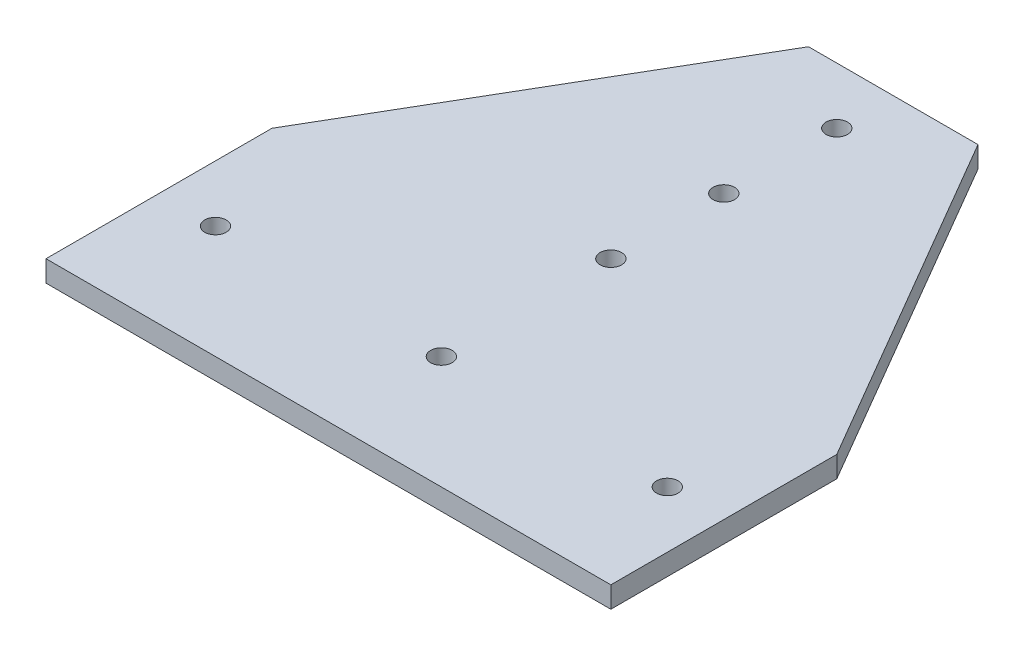
ISO-10303-21;
HEADER;
FILE_DESCRIPTION(('STEP AP214'),'2;1');
FILE_NAME('part.step','',(''),(''),'','','');
FILE_SCHEMA(('AUTOMOTIVE_DESIGN { 1 0 10303 214 1 1 1 1 }'));
ENDSEC;
DATA;
#1=APPLICATION_CONTEXT('core data for automotive mechanical design processes');
#2=APPLICATION_PROTOCOL_DEFINITION('international standard','automotive_design',2000,#1);
#3=PRODUCT_CONTEXT('',#1,'mechanical');
#4=PRODUCT('Part','Part','',(#3));
#5=PRODUCT_RELATED_PRODUCT_CATEGORY('part','',(#4));
#6=PRODUCT_DEFINITION_FORMATION('','',#4);
#7=PRODUCT_DEFINITION_CONTEXT('part definition',#1,'design');
#8=PRODUCT_DEFINITION('design','',#6,#7);
#9=PRODUCT_DEFINITION_SHAPE('','',#8);
#10=(LENGTH_UNIT() NAMED_UNIT(*) SI_UNIT(.MILLI.,.METRE.));
#11=(NAMED_UNIT(*) PLANE_ANGLE_UNIT() SI_UNIT($,.RADIAN.));
#12=(NAMED_UNIT(*) SI_UNIT($,.STERADIAN.) SOLID_ANGLE_UNIT());
#13=UNCERTAINTY_MEASURE_WITH_UNIT(LENGTH_MEASURE(1.E-05),#10,'distance_accuracy_value','');
#14=(GEOMETRIC_REPRESENTATION_CONTEXT(3) GLOBAL_UNCERTAINTY_ASSIGNED_CONTEXT((#13)) GLOBAL_UNIT_ASSIGNED_CONTEXT((#10,
#11,#12)) REPRESENTATION_CONTEXT('',''));
#15=CARTESIAN_POINT('',(0.,0.,0.));
#16=DIRECTION('',(0.,0.,1.));
#17=DIRECTION('',(1.,0.,0.));
#18=AXIS2_PLACEMENT_3D('',#15,#16,#17);
#19=CARTESIAN_POINT('',(41.8507772020725,4.7625,-24.4129533678756));
#20=DIRECTION('',(0.863778900898433,0.,-0.503871025524086));
#21=DIRECTION('',(-0.503871025524086,0.,-0.863778900898434));
#22=AXIS2_PLACEMENT_3D('',#19,#20,#21);
#23=PLANE('',#22);
#24=DIRECTION('',(0.503871025524086,0.,0.863778900898433));
#25=VECTOR('',#24,1.);
#26=CARTESIAN_POINT('',(41.8507772020725,0.,-24.4129533678756));
#27=LINE('',#26,#25);
#28=CARTESIAN_POINT('',(19.05,0.,-63.5));
#29=VERTEX_POINT('',#28);
#30=CARTESIAN_POINT('',(63.5,0.,12.7000000000001));
#31=VERTEX_POINT('',#30);
#32=EDGE_CURVE('E133',#29,#31,#27,.T.);
#33=ORIENTED_EDGE('',*,*,#32,.F.);
#34=DIRECTION('',(0.,-1.,0.));
#35=VECTOR('',#34,1.);
#36=CARTESIAN_POINT('',(19.05,4.7625,-63.5));
#37=LINE('',#36,#35);
#38=CARTESIAN_POINT('',(19.05,4.7625,-63.5));
#39=VERTEX_POINT('',#38);
#40=EDGE_CURVE('E11',#39,#29,#37,.T.);
#41=ORIENTED_EDGE('',*,*,#40,.F.);
#42=DIRECTION('',(0.503871025524086,0.,0.863778900898433));
#43=VECTOR('',#42,1.);
#44=CARTESIAN_POINT('',(41.8507772020725,4.7625,-24.4129533678756));
#45=LINE('',#44,#43);
#46=CARTESIAN_POINT('',(63.5,4.7625,12.7000000000001));
#47=VERTEX_POINT('',#46);
#48=EDGE_CURVE('E353',#39,#47,#45,.T.);
#49=ORIENTED_EDGE('',*,*,#48,.T.);
#50=DIRECTION('',(0.,-1.,0.));
#51=VECTOR('',#50,1.);
#52=CARTESIAN_POINT('',(63.5,4.7625,12.7000000000001));
#53=LINE('',#52,#51);
#54=EDGE_CURVE('E56',#47,#31,#53,.T.);
#55=ORIENTED_EDGE('',*,*,#54,.T.);
#56=EDGE_LOOP('',(#33,#41,#49,#55));
#57=FACE_BOUND('',#56,.T.);
#58=ADVANCED_FACE('F39',(#57),#23,.T.);
#59=CARTESIAN_POINT('',(0.,4.7625,-63.5));
#60=DIRECTION('',(0.,0.,-1.));
#61=DIRECTION('',(-1.,0.,0.));
#62=AXIS2_PLACEMENT_3D('',#59,#60,#61);
#63=PLANE('',#62);
#64=DIRECTION('',(1.,0.,0.));
#65=VECTOR('',#64,1.);
#66=CARTESIAN_POINT('',(0.,0.,-63.5));
#67=LINE('',#66,#65);
#68=CARTESIAN_POINT('',(-19.05,0.,-63.5));
#69=VERTEX_POINT('',#68);
#70=EDGE_CURVE('E130',#69,#29,#67,.T.);
#71=ORIENTED_EDGE('',*,*,#70,.F.);
#72=DIRECTION('',(0.,-1.,0.));
#73=VECTOR('',#72,1.);
#74=CARTESIAN_POINT('',(-19.05,4.7625,-63.5));
#75=LINE('',#74,#73);
#76=CARTESIAN_POINT('',(-19.05,4.7625,-63.5));
#77=VERTEX_POINT('',#76);
#78=EDGE_CURVE('E48',#77,#69,#75,.T.);
#79=ORIENTED_EDGE('',*,*,#78,.F.);
#80=DIRECTION('',(1.,0.,0.));
#81=VECTOR('',#80,1.);
#82=CARTESIAN_POINT('',(0.,4.7625,-63.5));
#83=LINE('',#82,#81);
#84=EDGE_CURVE('E355',#77,#39,#83,.T.);
#85=ORIENTED_EDGE('',*,*,#84,.T.);
#86=ORIENTED_EDGE('',*,*,#40,.T.);
#87=EDGE_LOOP('',(#71,#79,#85,#86));
#88=FACE_BOUND('',#87,.T.);
#89=ADVANCED_FACE('F131',(#88),#63,.T.);
#90=CARTESIAN_POINT('',(-41.8507772020725,4.7625,-24.4129533678756));
#91=DIRECTION('',(-0.863778900898434,0.,-0.503871025524086));
#92=DIRECTION('',(-0.503871025524086,0.,0.863778900898434));
#93=AXIS2_PLACEMENT_3D('',#90,#91,#92);
#94=PLANE('',#93);
#95=DIRECTION('',(0.503871025524086,0.,-0.863778900898434));
#96=VECTOR('',#95,1.);
#97=CARTESIAN_POINT('',(-41.8507772020725,0.,-24.4129533678756));
#98=LINE('',#97,#96);
#99=CARTESIAN_POINT('',(-63.5,0.,12.7));
#100=VERTEX_POINT('',#99);
#101=EDGE_CURVE('E126',#100,#69,#98,.T.);
#102=ORIENTED_EDGE('',*,*,#101,.F.);
#103=DIRECTION('',(0.,-1.,0.));
#104=VECTOR('',#103,1.);
#105=CARTESIAN_POINT('',(-63.5,4.7625,12.7));
#106=LINE('',#105,#104);
#107=CARTESIAN_POINT('',(-63.5,4.7625,12.7));
#108=VERTEX_POINT('',#107);
#109=EDGE_CURVE('E116',#108,#100,#106,.T.);
#110=ORIENTED_EDGE('',*,*,#109,.F.);
#111=DIRECTION('',(0.503871025524086,0.,-0.863778900898434));
#112=VECTOR('',#111,1.);
#113=CARTESIAN_POINT('',(-41.8507772020725,4.7625,-24.4129533678756));
#114=LINE('',#113,#112);
#115=EDGE_CURVE('E110',#108,#77,#114,.T.);
#116=ORIENTED_EDGE('',*,*,#115,.T.);
#117=ORIENTED_EDGE('',*,*,#78,.T.);
#118=EDGE_LOOP('',(#102,#110,#116,#117));
#119=FACE_BOUND('',#118,.T.);
#120=ADVANCED_FACE('F124',(#119),#94,.T.);
#121=CARTESIAN_POINT('',(-63.5,4.7625,0.));
#122=DIRECTION('',(1.,0.,0.));
#123=DIRECTION('',(0.,0.,-1.));
#124=AXIS2_PLACEMENT_3D('',#121,#122,#123);
#125=PLANE('',#124);
#126=DIRECTION('',(0.,0.,1.));
#127=VECTOR('',#126,1.);
#128=CARTESIAN_POINT('',(-63.5,0.,0.));
#129=LINE('',#128,#127);
#130=CARTESIAN_POINT('',(-63.5,0.,63.5));
#131=VERTEX_POINT('',#130);
#132=EDGE_CURVE('E115',#100,#131,#129,.T.);
#133=ORIENTED_EDGE('',*,*,#132,.T.);
#134=DIRECTION('',(0.,-1.,0.));
#135=VECTOR('',#134,1.);
#136=CARTESIAN_POINT('',(-63.5,4.7625,63.5));
#137=LINE('',#136,#135);
#138=CARTESIAN_POINT('',(-63.5,4.7625,63.5));
#139=VERTEX_POINT('',#138);
#140=EDGE_CURVE('E98',#139,#131,#137,.T.);
#141=ORIENTED_EDGE('',*,*,#140,.F.);
#142=DIRECTION('',(0.,0.,1.));
#143=VECTOR('',#142,1.);
#144=CARTESIAN_POINT('',(-63.5,4.7625,0.));
#145=LINE('',#144,#143);
#146=EDGE_CURVE('E103',#108,#139,#145,.T.);
#147=ORIENTED_EDGE('',*,*,#146,.F.);
#148=ORIENTED_EDGE('',*,*,#109,.T.);
#149=EDGE_LOOP('',(#133,#141,#147,#148));
#150=FACE_BOUND('',#149,.T.);
#151=ADVANCED_FACE('F113',(#150),#125,.F.);
#152=CARTESIAN_POINT('',(0.,4.7625,63.5));
#153=DIRECTION('',(0.,0.,-1.));
#154=DIRECTION('',(-1.,0.,0.));
#155=AXIS2_PLACEMENT_3D('',#152,#153,#154);
#156=PLANE('',#155);
#157=DIRECTION('',(1.,0.,0.));
#158=VECTOR('',#157,1.);
#159=CARTESIAN_POINT('',(0.,0.,63.5));
#160=LINE('',#159,#158);
#161=CARTESIAN_POINT('',(63.5,0.,63.5));
#162=VERTEX_POINT('',#161);
#163=EDGE_CURVE('E137',#131,#162,#160,.T.);
#164=ORIENTED_EDGE('',*,*,#163,.T.);
#165=DIRECTION('',(0.,-1.,0.));
#166=VECTOR('',#165,1.);
#167=CARTESIAN_POINT('',(63.5,4.7625,63.5));
#168=LINE('',#167,#166);
#169=CARTESIAN_POINT('',(63.5,4.7625,63.5));
#170=VERTEX_POINT('',#169);
#171=EDGE_CURVE('E76',#170,#162,#168,.T.);
#172=ORIENTED_EDGE('',*,*,#171,.F.);
#173=DIRECTION('',(1.,0.,0.));
#174=VECTOR('',#173,1.);
#175=CARTESIAN_POINT('',(0.,4.7625,63.5));
#176=LINE('',#175,#174);
#177=EDGE_CURVE('E94',#139,#170,#176,.T.);
#178=ORIENTED_EDGE('',*,*,#177,.F.);
#179=ORIENTED_EDGE('',*,*,#140,.T.);
#180=EDGE_LOOP('',(#164,#172,#178,#179));
#181=FACE_BOUND('',#180,.T.);
#182=ADVANCED_FACE('F96',(#181),#156,.F.);
#183=CARTESIAN_POINT('',(0.,4.7625,38.1));
#184=DIRECTION('',(0.,-1.,0.));
#185=DIRECTION('',(0.,0.,-1.));
#186=AXIS2_PLACEMENT_3D('',#183,#184,#185);
#187=CYLINDRICAL_SURFACE('',#186,2.413);
#188=CARTESIAN_POINT('',(0.,4.7625,38.1));
#189=DIRECTION('',(0.,1.,0.));
#190=DIRECTION('',(0.,0.,1.));
#191=AXIS2_PLACEMENT_3D('',#188,#189,#190);
#192=CIRCLE('',#191,2.413);
#193=CARTESIAN_POINT('',(0.,4.7625,35.687));
#194=VERTEX_POINT('',#193);
#195=EDGE_CURVE('E350',#194,#194,#192,.T.);
#196=CARTESIAN_POINT('',(0.,0.,38.1));
#197=DIRECTION('',(0.,1.,0.));
#198=DIRECTION('',(0.,0.,1.));
#199=AXIS2_PLACEMENT_3D('',#196,#197,#198);
#200=CIRCLE('',#199,2.413);
#201=CARTESIAN_POINT('',(0.,0.,35.687));
#202=VERTEX_POINT('',#201);
#203=EDGE_CURVE('E162',#202,#202,#200,.T.);
#204=CARTESIAN_POINT('',(0.,4.7625,35.687));
#205=CARTESIAN_POINT('',(0.,4.712890625,35.687));
#206=CARTESIAN_POINT('',(0.,4.66328125,35.687));
#207=CARTESIAN_POINT('',(0.,4.5640625,35.687));
#208=CARTESIAN_POINT('',(0.,4.514453125,35.687));
#209=CARTESIAN_POINT('',(0.,4.415234375,35.687));
#210=CARTESIAN_POINT('',(0.,4.365625,35.687));
#211=CARTESIAN_POINT('',(0.,4.26640625,35.687));
#212=CARTESIAN_POINT('',(0.,4.216796875,35.687));
#213=CARTESIAN_POINT('',(0.,4.117578125,35.687));
#214=CARTESIAN_POINT('',(0.,4.06796875,35.687));
#215=CARTESIAN_POINT('',(0.,3.96875,35.687));
#216=CARTESIAN_POINT('',(0.,3.919140625,35.687));
#217=CARTESIAN_POINT('',(0.,3.819921875,35.687));
#218=CARTESIAN_POINT('',(0.,3.7703125,35.687));
#219=CARTESIAN_POINT('',(0.,3.67109375,35.687));
#220=CARTESIAN_POINT('',(0.,3.621484375,35.687));
#221=CARTESIAN_POINT('',(0.,3.522265625,35.687));
#222=CARTESIAN_POINT('',(0.,3.47265625,35.687));
#223=CARTESIAN_POINT('',(0.,3.3734375,35.687));
#224=CARTESIAN_POINT('',(0.,3.323828125,35.687));
#225=CARTESIAN_POINT('',(0.,3.224609375,35.687));
#226=CARTESIAN_POINT('',(0.,3.175,35.687));
#227=CARTESIAN_POINT('',(0.,3.07578125,35.687));
#228=CARTESIAN_POINT('',(0.,3.026171875,35.687));
#229=CARTESIAN_POINT('',(0.,2.926953125,35.687));
#230=CARTESIAN_POINT('',(0.,2.87734375,35.687));
#231=CARTESIAN_POINT('',(0.,2.778125,35.687));
#232=CARTESIAN_POINT('',(0.,2.728515625,35.687));
#233=CARTESIAN_POINT('',(0.,2.629296875,35.687));
#234=CARTESIAN_POINT('',(0.,2.5796875,35.687));
#235=CARTESIAN_POINT('',(0.,2.48046875,35.687));
#236=CARTESIAN_POINT('',(0.,2.430859375,35.687));
#237=CARTESIAN_POINT('',(0.,2.331640625,35.687));
#238=CARTESIAN_POINT('',(0.,2.28203125,35.687));
#239=CARTESIAN_POINT('',(0.,2.1828125,35.687));
#240=CARTESIAN_POINT('',(0.,2.133203125,35.687));
#241=CARTESIAN_POINT('',(0.,2.033984375,35.687));
#242=CARTESIAN_POINT('',(0.,1.984375,35.687));
#243=CARTESIAN_POINT('',(0.,1.88515625,35.687));
#244=CARTESIAN_POINT('',(0.,1.835546875,35.687));
#245=CARTESIAN_POINT('',(0.,1.736328125,35.687));
#246=CARTESIAN_POINT('',(0.,1.68671875,35.687));
#247=CARTESIAN_POINT('',(0.,1.5875,35.687));
#248=CARTESIAN_POINT('',(0.,1.537890625,35.687));
#249=CARTESIAN_POINT('',(0.,1.438671875,35.687));
#250=CARTESIAN_POINT('',(0.,1.3890625,35.687));
#251=CARTESIAN_POINT('',(0.,1.28984375,35.687));
#252=CARTESIAN_POINT('',(0.,1.240234375,35.687));
#253=CARTESIAN_POINT('',(0.,1.141015625,35.687));
#254=CARTESIAN_POINT('',(0.,1.09140625,35.687));
#255=CARTESIAN_POINT('',(0.,0.992187499999999,35.687));
#256=CARTESIAN_POINT('',(0.,0.942578124999999,35.687));
#257=CARTESIAN_POINT('',(0.,0.843359375,35.687));
#258=CARTESIAN_POINT('',(0.,0.79375,35.687));
#259=CARTESIAN_POINT('',(0.,0.69453125,35.687));
#260=CARTESIAN_POINT('',(0.,0.644921875,35.687));
#261=CARTESIAN_POINT('',(0.,0.545703125,35.687));
#262=CARTESIAN_POINT('',(0.,0.49609375,35.687));
#263=CARTESIAN_POINT('',(0.,0.396875,35.687));
#264=CARTESIAN_POINT('',(0.,0.347265625,35.687));
#265=CARTESIAN_POINT('',(0.,0.248046875,35.687));
#266=CARTESIAN_POINT('',(0.,0.1984375,35.687));
#267=CARTESIAN_POINT('',(0.,0.09921875,35.687));
#268=CARTESIAN_POINT('',(0.,0.049609375,35.687));
#269=CARTESIAN_POINT('',(0.,0.,35.687));
#270=B_SPLINE_CURVE_WITH_KNOTS('',3,(#204,#205,#206,#207,#208,#209,#210,#211,#212,#213,#214,
#215,#216,#217,#218,#219,#220,#221,#222,#223,#224,#225,#226,#227,#228,#229,#230,#231,#232,#233,
#234,#235,#236,#237,#238,#239,#240,#241,#242,#243,#244,#245,#246,#247,#248,#249,#250,#251,#252,
#253,#254,#255,#256,#257,#258,#259,#260,#261,#262,#263,#264,#265,#266,#267,#268,#269),
.UNSPECIFIED.,.F.,.F.,(4,2,2,2,2,2,2,2,2,2,2,2,2,2,2,2,2,2,2,2,2,2,2,2,2,2,2,2,2,2,2,2,4),(0.,
0.148828125,0.29765625,0.446484375,0.5953125,0.744140625,0.892968750000001,1.041796875,1.190625,
1.339453125,1.48828125,1.637109375,1.7859375,1.934765625,2.08359375,2.232421875,2.38125,
2.530078125,2.67890625,2.827734375,2.9765625,3.125390625,3.27421875,3.423046875,3.571875,
3.720703125,3.86953125,4.018359375,4.1671875,4.316015625,4.46484375,4.613671875,4.7625),.UNSPECIFIED.);
#271=EDGE_CURVE('BSEAM185',#194,#202,#270,.T.);
#272=ORIENTED_EDGE('',*,*,#195,.T.);
#273=ORIENTED_EDGE('',*,*,#203,.F.);
#274=ORIENTED_EDGE('',*,*,#271,.T.);
#275=ORIENTED_EDGE('',*,*,#271,.F.);
#276=EDGE_LOOP('',(#272,#274,#273,#275));
#277=FACE_BOUND('',#276,.T.);
#278=ADVANCED_FACE('F185',(#277),#187,.F.);
#279=CARTESIAN_POINT('',(-50.8,4.7625,38.1));
#280=DIRECTION('',(0.,-1.,0.));
#281=DIRECTION('',(0.,0.,-1.));
#282=AXIS2_PLACEMENT_3D('',#279,#280,#281);
#283=CYLINDRICAL_SURFACE('',#282,2.41299999999999);
#284=CARTESIAN_POINT('',(-50.8,4.7625,38.1));
#285=DIRECTION('',(0.,1.,0.));
#286=DIRECTION('',(0.,0.,1.));
#287=AXIS2_PLACEMENT_3D('',#284,#285,#286);
#288=CIRCLE('',#287,2.41299999999999);
#289=CARTESIAN_POINT('',(-50.8,4.7625,35.687));
#290=VERTEX_POINT('',#289);
#291=EDGE_CURVE('E347',#290,#290,#288,.T.);
#292=CARTESIAN_POINT('',(-50.8,0.,38.1));
#293=DIRECTION('',(0.,1.,0.));
#294=DIRECTION('',(0.,0.,1.));
#295=AXIS2_PLACEMENT_3D('',#292,#293,#294);
#296=CIRCLE('',#295,2.41299999999999);
#297=CARTESIAN_POINT('',(-50.8,0.,35.687));
#298=VERTEX_POINT('',#297);
#299=EDGE_CURVE('E159',#298,#298,#296,.T.);
#300=CARTESIAN_POINT('',(-50.8,4.7625,35.687));
#301=CARTESIAN_POINT('',(-50.8,4.712890625,35.687));
#302=CARTESIAN_POINT('',(-50.8,4.66328125,35.687));
#303=CARTESIAN_POINT('',(-50.8,4.5640625,35.687));
#304=CARTESIAN_POINT('',(-50.8,4.514453125,35.687));
#305=CARTESIAN_POINT('',(-50.8,4.415234375,35.687));
#306=CARTESIAN_POINT('',(-50.8,4.365625,35.687));
#307=CARTESIAN_POINT('',(-50.8,4.26640625,35.687));
#308=CARTESIAN_POINT('',(-50.8,4.216796875,35.687));
#309=CARTESIAN_POINT('',(-50.8,4.117578125,35.687));
#310=CARTESIAN_POINT('',(-50.8,4.06796875,35.687));
#311=CARTESIAN_POINT('',(-50.8,3.96875,35.687));
#312=CARTESIAN_POINT('',(-50.8,3.919140625,35.687));
#313=CARTESIAN_POINT('',(-50.8,3.819921875,35.687));
#314=CARTESIAN_POINT('',(-50.8,3.7703125,35.687));
#315=CARTESIAN_POINT('',(-50.8,3.67109375,35.687));
#316=CARTESIAN_POINT('',(-50.8,3.621484375,35.687));
#317=CARTESIAN_POINT('',(-50.8,3.522265625,35.687));
#318=CARTESIAN_POINT('',(-50.8,3.47265625,35.687));
#319=CARTESIAN_POINT('',(-50.8,3.3734375,35.687));
#320=CARTESIAN_POINT('',(-50.8,3.323828125,35.687));
#321=CARTESIAN_POINT('',(-50.8,3.224609375,35.687));
#322=CARTESIAN_POINT('',(-50.8,3.175,35.687));
#323=CARTESIAN_POINT('',(-50.8,3.07578125,35.687));
#324=CARTESIAN_POINT('',(-50.8,3.026171875,35.687));
#325=CARTESIAN_POINT('',(-50.8,2.926953125,35.687));
#326=CARTESIAN_POINT('',(-50.8,2.87734375,35.687));
#327=CARTESIAN_POINT('',(-50.8,2.778125,35.687));
#328=CARTESIAN_POINT('',(-50.8,2.728515625,35.687));
#329=CARTESIAN_POINT('',(-50.8,2.629296875,35.687));
#330=CARTESIAN_POINT('',(-50.8,2.5796875,35.687));
#331=CARTESIAN_POINT('',(-50.8,2.48046875,35.687));
#332=CARTESIAN_POINT('',(-50.8,2.430859375,35.687));
#333=CARTESIAN_POINT('',(-50.8,2.331640625,35.687));
#334=CARTESIAN_POINT('',(-50.8,2.28203125,35.687));
#335=CARTESIAN_POINT('',(-50.8,2.1828125,35.687));
#336=CARTESIAN_POINT('',(-50.8,2.133203125,35.687));
#337=CARTESIAN_POINT('',(-50.8,2.033984375,35.687));
#338=CARTESIAN_POINT('',(-50.8,1.984375,35.687));
#339=CARTESIAN_POINT('',(-50.8,1.88515625,35.687));
#340=CARTESIAN_POINT('',(-50.8,1.835546875,35.687));
#341=CARTESIAN_POINT('',(-50.8,1.736328125,35.687));
#342=CARTESIAN_POINT('',(-50.8,1.68671875,35.687));
#343=CARTESIAN_POINT('',(-50.8,1.5875,35.687));
#344=CARTESIAN_POINT('',(-50.8,1.537890625,35.687));
#345=CARTESIAN_POINT('',(-50.8,1.438671875,35.687));
#346=CARTESIAN_POINT('',(-50.8,1.3890625,35.687));
#347=CARTESIAN_POINT('',(-50.8,1.28984375,35.687));
#348=CARTESIAN_POINT('',(-50.8,1.240234375,35.687));
#349=CARTESIAN_POINT('',(-50.8,1.141015625,35.687));
#350=CARTESIAN_POINT('',(-50.8,1.09140625,35.687));
#351=CARTESIAN_POINT('',(-50.8,0.992187499999999,35.687));
#352=CARTESIAN_POINT('',(-50.8,0.942578124999999,35.687));
#353=CARTESIAN_POINT('',(-50.8,0.843359375,35.687));
#354=CARTESIAN_POINT('',(-50.8,0.79375,35.687));
#355=CARTESIAN_POINT('',(-50.8,0.69453125,35.687));
#356=CARTESIAN_POINT('',(-50.8,0.644921875,35.687));
#357=CARTESIAN_POINT('',(-50.8,0.545703125,35.687));
#358=CARTESIAN_POINT('',(-50.8,0.49609375,35.687));
#359=CARTESIAN_POINT('',(-50.8,0.396875,35.687));
#360=CARTESIAN_POINT('',(-50.8,0.347265625,35.687));
#361=CARTESIAN_POINT('',(-50.8,0.248046875,35.687));
#362=CARTESIAN_POINT('',(-50.8,0.1984375,35.687));
#363=CARTESIAN_POINT('',(-50.8,0.09921875,35.687));
#364=CARTESIAN_POINT('',(-50.8,0.049609375,35.687));
#365=CARTESIAN_POINT('',(-50.8,0.,35.687));
#366=B_SPLINE_CURVE_WITH_KNOTS('',3,(#300,#301,#302,#303,#304,#305,#306,#307,#308,#309,#310,
#311,#312,#313,#314,#315,#316,#317,#318,#319,#320,#321,#322,#323,#324,#325,#326,#327,#328,#329,
#330,#331,#332,#333,#334,#335,#336,#337,#338,#339,#340,#341,#342,#343,#344,#345,#346,#347,#348,
#349,#350,#351,#352,#353,#354,#355,#356,#357,#358,#359,#360,#361,#362,#363,#364,#365),
.UNSPECIFIED.,.F.,.F.,(4,2,2,2,2,2,2,2,2,2,2,2,2,2,2,2,2,2,2,2,2,2,2,2,2,2,2,2,2,2,2,2,4),(0.,
0.148828125,0.29765625,0.446484375,0.5953125,0.744140625,0.892968750000001,1.041796875,1.190625,
1.339453125,1.48828125,1.637109375,1.7859375,1.934765625,2.08359375,2.232421875,2.38125,
2.530078125,2.67890625,2.827734375,2.9765625,3.125390625,3.27421875,3.423046875,3.571875,
3.720703125,3.86953125,4.018359375,4.1671875,4.316015625,4.46484375,4.613671875,4.7625),.UNSPECIFIED.);
#367=EDGE_CURVE('BSEAM188',#290,#298,#366,.T.);
#368=ORIENTED_EDGE('',*,*,#291,.T.);
#369=ORIENTED_EDGE('',*,*,#299,.F.);
#370=ORIENTED_EDGE('',*,*,#367,.T.);
#371=ORIENTED_EDGE('',*,*,#367,.F.);
#372=EDGE_LOOP('',(#368,#370,#369,#371));
#373=FACE_BOUND('',#372,.T.);
#374=ADVANCED_FACE('F188',(#373),#283,.F.);
#375=CARTESIAN_POINT('',(50.8,4.7625,38.1));
#376=DIRECTION('',(0.,-1.,0.));
#377=DIRECTION('',(0.,0.,-1.));
#378=AXIS2_PLACEMENT_3D('',#375,#376,#377);
#379=CYLINDRICAL_SURFACE('',#378,2.41299999999999);
#380=CARTESIAN_POINT('',(50.8,4.7625,38.1));
#381=DIRECTION('',(0.,1.,0.));
#382=DIRECTION('',(0.,0.,1.));
#383=AXIS2_PLACEMENT_3D('',#380,#381,#382);
#384=CIRCLE('',#383,2.41299999999999);
#385=CARTESIAN_POINT('',(50.8,4.7625,35.687));
#386=VERTEX_POINT('',#385);
#387=EDGE_CURVE('E340',#386,#386,#384,.T.);
#388=CARTESIAN_POINT('',(50.8,0.,38.1));
#389=DIRECTION('',(0.,1.,0.));
#390=DIRECTION('',(0.,0.,1.));
#391=AXIS2_PLACEMENT_3D('',#388,#389,#390);
#392=CIRCLE('',#391,2.41299999999999);
#393=CARTESIAN_POINT('',(50.8,0.,35.687));
#394=VERTEX_POINT('',#393);
#395=EDGE_CURVE('E156',#394,#394,#392,.T.);
#396=CARTESIAN_POINT('',(50.8,4.7625,35.687));
#397=CARTESIAN_POINT('',(50.8,4.712890625,35.687));
#398=CARTESIAN_POINT('',(50.8,4.66328125,35.687));
#399=CARTESIAN_POINT('',(50.8,4.5640625,35.687));
#400=CARTESIAN_POINT('',(50.8,4.514453125,35.687));
#401=CARTESIAN_POINT('',(50.8,4.415234375,35.687));
#402=CARTESIAN_POINT('',(50.8,4.365625,35.687));
#403=CARTESIAN_POINT('',(50.8,4.26640625,35.687));
#404=CARTESIAN_POINT('',(50.8,4.216796875,35.687));
#405=CARTESIAN_POINT('',(50.8,4.117578125,35.687));
#406=CARTESIAN_POINT('',(50.8,4.06796875,35.687));
#407=CARTESIAN_POINT('',(50.8,3.96875,35.687));
#408=CARTESIAN_POINT('',(50.8,3.919140625,35.687));
#409=CARTESIAN_POINT('',(50.8,3.819921875,35.687));
#410=CARTESIAN_POINT('',(50.8,3.7703125,35.687));
#411=CARTESIAN_POINT('',(50.8,3.67109375,35.687));
#412=CARTESIAN_POINT('',(50.8,3.621484375,35.687));
#413=CARTESIAN_POINT('',(50.8,3.522265625,35.687));
#414=CARTESIAN_POINT('',(50.8,3.47265625,35.687));
#415=CARTESIAN_POINT('',(50.8,3.3734375,35.687));
#416=CARTESIAN_POINT('',(50.8,3.323828125,35.687));
#417=CARTESIAN_POINT('',(50.8,3.224609375,35.687));
#418=CARTESIAN_POINT('',(50.8,3.175,35.687));
#419=CARTESIAN_POINT('',(50.8,3.07578125,35.687));
#420=CARTESIAN_POINT('',(50.8,3.026171875,35.687));
#421=CARTESIAN_POINT('',(50.8,2.926953125,35.687));
#422=CARTESIAN_POINT('',(50.8,2.87734375,35.687));
#423=CARTESIAN_POINT('',(50.8,2.778125,35.687));
#424=CARTESIAN_POINT('',(50.8,2.728515625,35.687));
#425=CARTESIAN_POINT('',(50.8,2.629296875,35.687));
#426=CARTESIAN_POINT('',(50.8,2.5796875,35.687));
#427=CARTESIAN_POINT('',(50.8,2.48046875,35.687));
#428=CARTESIAN_POINT('',(50.8,2.430859375,35.687));
#429=CARTESIAN_POINT('',(50.8,2.331640625,35.687));
#430=CARTESIAN_POINT('',(50.8,2.28203125,35.687));
#431=CARTESIAN_POINT('',(50.8,2.1828125,35.687));
#432=CARTESIAN_POINT('',(50.8,2.133203125,35.687));
#433=CARTESIAN_POINT('',(50.8,2.033984375,35.687));
#434=CARTESIAN_POINT('',(50.8,1.984375,35.687));
#435=CARTESIAN_POINT('',(50.8,1.88515625,35.687));
#436=CARTESIAN_POINT('',(50.8,1.835546875,35.687));
#437=CARTESIAN_POINT('',(50.8,1.736328125,35.687));
#438=CARTESIAN_POINT('',(50.8,1.68671875,35.687));
#439=CARTESIAN_POINT('',(50.8,1.5875,35.687));
#440=CARTESIAN_POINT('',(50.8,1.537890625,35.687));
#441=CARTESIAN_POINT('',(50.8,1.438671875,35.687));
#442=CARTESIAN_POINT('',(50.8,1.3890625,35.687));
#443=CARTESIAN_POINT('',(50.8,1.28984375,35.687));
#444=CARTESIAN_POINT('',(50.8,1.240234375,35.687));
#445=CARTESIAN_POINT('',(50.8,1.141015625,35.687));
#446=CARTESIAN_POINT('',(50.8,1.09140625,35.687));
#447=CARTESIAN_POINT('',(50.8,0.992187499999999,35.687));
#448=CARTESIAN_POINT('',(50.8,0.942578124999999,35.687));
#449=CARTESIAN_POINT('',(50.8,0.843359375,35.687));
#450=CARTESIAN_POINT('',(50.8,0.79375,35.687));
#451=CARTESIAN_POINT('',(50.8,0.69453125,35.687));
#452=CARTESIAN_POINT('',(50.8,0.644921875,35.687));
#453=CARTESIAN_POINT('',(50.8,0.545703125,35.687));
#454=CARTESIAN_POINT('',(50.8,0.49609375,35.687));
#455=CARTESIAN_POINT('',(50.8,0.396875,35.687));
#456=CARTESIAN_POINT('',(50.8,0.347265625,35.687));
#457=CARTESIAN_POINT('',(50.8,0.248046875,35.687));
#458=CARTESIAN_POINT('',(50.8,0.1984375,35.687));
#459=CARTESIAN_POINT('',(50.8,0.09921875,35.687));
#460=CARTESIAN_POINT('',(50.8,0.049609375,35.687));
#461=CARTESIAN_POINT('',(50.8,0.,35.687));
#462=B_SPLINE_CURVE_WITH_KNOTS('',3,(#396,#397,#398,#399,#400,#401,#402,#403,#404,#405,#406,
#407,#408,#409,#410,#411,#412,#413,#414,#415,#416,#417,#418,#419,#420,#421,#422,#423,#424,#425,
#426,#427,#428,#429,#430,#431,#432,#433,#434,#435,#436,#437,#438,#439,#440,#441,#442,#443,#444,
#445,#446,#447,#448,#449,#450,#451,#452,#453,#454,#455,#456,#457,#458,#459,#460,#461),
.UNSPECIFIED.,.F.,.F.,(4,2,2,2,2,2,2,2,2,2,2,2,2,2,2,2,2,2,2,2,2,2,2,2,2,2,2,2,2,2,2,2,4),(0.,
0.148828125,0.29765625,0.446484375,0.5953125,0.744140625,0.892968750000001,1.041796875,1.190625,
1.339453125,1.48828125,1.637109375,1.7859375,1.934765625,2.08359375,2.232421875,2.38125,
2.530078125,2.67890625,2.827734375,2.9765625,3.125390625,3.27421875,3.423046875,3.571875,
3.720703125,3.86953125,4.018359375,4.1671875,4.316015625,4.46484375,4.613671875,4.7625),.UNSPECIFIED.);
#463=EDGE_CURVE('BSEAM192',#386,#394,#462,.T.);
#464=ORIENTED_EDGE('',*,*,#387,.T.);
#465=ORIENTED_EDGE('',*,*,#395,.F.);
#466=ORIENTED_EDGE('',*,*,#463,.T.);
#467=ORIENTED_EDGE('',*,*,#463,.F.);
#468=EDGE_LOOP('',(#464,#466,#465,#467));
#469=FACE_BOUND('',#468,.T.);
#470=ADVANCED_FACE('F192',(#469),#379,.F.);
#471=CARTESIAN_POINT('',(0.,4.7625,-50.8));
#472=DIRECTION('',(0.,-1.,0.));
#473=DIRECTION('',(0.,0.,-1.));
#474=AXIS2_PLACEMENT_3D('',#471,#472,#473);
#475=CYLINDRICAL_SURFACE('',#474,2.413);
#476=CARTESIAN_POINT('',(0.,4.7625,-50.8));
#477=DIRECTION('',(0.,1.,0.));
#478=DIRECTION('',(0.,0.,1.));
#479=AXIS2_PLACEMENT_3D('',#476,#477,#478);
#480=CIRCLE('',#479,2.413);
#481=CARTESIAN_POINT('',(0.,4.7625,-53.213));
#482=VERTEX_POINT('',#481);
#483=EDGE_CURVE('E337',#482,#482,#480,.T.);
#484=CARTESIAN_POINT('',(0.,0.,-50.8));
#485=DIRECTION('',(0.,1.,0.));
#486=DIRECTION('',(0.,0.,1.));
#487=AXIS2_PLACEMENT_3D('',#484,#485,#486);
#488=CIRCLE('',#487,2.413);
#489=CARTESIAN_POINT('',(0.,0.,-53.213));
#490=VERTEX_POINT('',#489);
#491=EDGE_CURVE('E153',#490,#490,#488,.T.);
#492=CARTESIAN_POINT('',(0.,4.7625,-53.213));
#493=CARTESIAN_POINT('',(0.,4.712890625,-53.213));
#494=CARTESIAN_POINT('',(0.,4.66328125,-53.213));
#495=CARTESIAN_POINT('',(0.,4.5640625,-53.213));
#496=CARTESIAN_POINT('',(0.,4.514453125,-53.213));
#497=CARTESIAN_POINT('',(0.,4.415234375,-53.213));
#498=CARTESIAN_POINT('',(0.,4.365625,-53.213));
#499=CARTESIAN_POINT('',(0.,4.26640625,-53.213));
#500=CARTESIAN_POINT('',(0.,4.216796875,-53.213));
#501=CARTESIAN_POINT('',(0.,4.117578125,-53.213));
#502=CARTESIAN_POINT('',(0.,4.06796875,-53.213));
#503=CARTESIAN_POINT('',(0.,3.96875,-53.213));
#504=CARTESIAN_POINT('',(0.,3.919140625,-53.213));
#505=CARTESIAN_POINT('',(0.,3.819921875,-53.213));
#506=CARTESIAN_POINT('',(0.,3.7703125,-53.213));
#507=CARTESIAN_POINT('',(0.,3.67109375,-53.213));
#508=CARTESIAN_POINT('',(0.,3.621484375,-53.213));
#509=CARTESIAN_POINT('',(0.,3.522265625,-53.213));
#510=CARTESIAN_POINT('',(0.,3.47265625,-53.213));
#511=CARTESIAN_POINT('',(0.,3.3734375,-53.213));
#512=CARTESIAN_POINT('',(0.,3.323828125,-53.213));
#513=CARTESIAN_POINT('',(0.,3.224609375,-53.213));
#514=CARTESIAN_POINT('',(0.,3.175,-53.213));
#515=CARTESIAN_POINT('',(0.,3.07578125,-53.213));
#516=CARTESIAN_POINT('',(0.,3.026171875,-53.213));
#517=CARTESIAN_POINT('',(0.,2.926953125,-53.213));
#518=CARTESIAN_POINT('',(0.,2.87734375,-53.213));
#519=CARTESIAN_POINT('',(0.,2.778125,-53.213));
#520=CARTESIAN_POINT('',(0.,2.728515625,-53.213));
#521=CARTESIAN_POINT('',(0.,2.629296875,-53.213));
#522=CARTESIAN_POINT('',(0.,2.5796875,-53.213));
#523=CARTESIAN_POINT('',(0.,2.48046875,-53.213));
#524=CARTESIAN_POINT('',(0.,2.430859375,-53.213));
#525=CARTESIAN_POINT('',(0.,2.331640625,-53.213));
#526=CARTESIAN_POINT('',(0.,2.28203125,-53.213));
#527=CARTESIAN_POINT('',(0.,2.1828125,-53.213));
#528=CARTESIAN_POINT('',(0.,2.133203125,-53.213));
#529=CARTESIAN_POINT('',(0.,2.033984375,-53.213));
#530=CARTESIAN_POINT('',(0.,1.984375,-53.213));
#531=CARTESIAN_POINT('',(0.,1.88515625,-53.213));
#532=CARTESIAN_POINT('',(0.,1.835546875,-53.213));
#533=CARTESIAN_POINT('',(0.,1.736328125,-53.213));
#534=CARTESIAN_POINT('',(0.,1.68671875,-53.213));
#535=CARTESIAN_POINT('',(0.,1.5875,-53.213));
#536=CARTESIAN_POINT('',(0.,1.537890625,-53.213));
#537=CARTESIAN_POINT('',(0.,1.438671875,-53.213));
#538=CARTESIAN_POINT('',(0.,1.3890625,-53.213));
#539=CARTESIAN_POINT('',(0.,1.28984375,-53.213));
#540=CARTESIAN_POINT('',(0.,1.240234375,-53.213));
#541=CARTESIAN_POINT('',(0.,1.141015625,-53.213));
#542=CARTESIAN_POINT('',(0.,1.09140625,-53.213));
#543=CARTESIAN_POINT('',(0.,0.992187499999999,-53.213));
#544=CARTESIAN_POINT('',(0.,0.942578124999999,-53.213));
#545=CARTESIAN_POINT('',(0.,0.843359375,-53.213));
#546=CARTESIAN_POINT('',(0.,0.79375,-53.213));
#547=CARTESIAN_POINT('',(0.,0.69453125,-53.213));
#548=CARTESIAN_POINT('',(0.,0.644921875,-53.213));
#549=CARTESIAN_POINT('',(0.,0.545703125,-53.213));
#550=CARTESIAN_POINT('',(0.,0.49609375,-53.213));
#551=CARTESIAN_POINT('',(0.,0.396875,-53.213));
#552=CARTESIAN_POINT('',(0.,0.347265625,-53.213));
#553=CARTESIAN_POINT('',(0.,0.248046875,-53.213));
#554=CARTESIAN_POINT('',(0.,0.1984375,-53.213));
#555=CARTESIAN_POINT('',(0.,0.09921875,-53.213));
#556=CARTESIAN_POINT('',(0.,0.049609375,-53.213));
#557=CARTESIAN_POINT('',(0.,0.,-53.213));
#558=B_SPLINE_CURVE_WITH_KNOTS('',3,(#492,#493,#494,#495,#496,#497,#498,#499,#500,#501,#502,
#503,#504,#505,#506,#507,#508,#509,#510,#511,#512,#513,#514,#515,#516,#517,#518,#519,#520,#521,
#522,#523,#524,#525,#526,#527,#528,#529,#530,#531,#532,#533,#534,#535,#536,#537,#538,#539,#540,
#541,#542,#543,#544,#545,#546,#547,#548,#549,#550,#551,#552,#553,#554,#555,#556,#557),
.UNSPECIFIED.,.F.,.F.,(4,2,2,2,2,2,2,2,2,2,2,2,2,2,2,2,2,2,2,2,2,2,2,2,2,2,2,2,2,2,2,2,4),(0.,
0.148828125,0.29765625,0.446484375,0.5953125,0.744140625,0.892968750000001,1.041796875,1.190625,
1.339453125,1.48828125,1.637109375,1.7859375,1.934765625,2.08359375,2.232421875,2.38125,
2.530078125,2.67890625,2.827734375,2.9765625,3.125390625,3.27421875,3.423046875,3.571875,
3.720703125,3.86953125,4.018359375,4.1671875,4.316015625,4.46484375,4.613671875,4.7625),.UNSPECIFIED.);
#559=EDGE_CURVE('BSEAM196',#482,#490,#558,.T.);
#560=ORIENTED_EDGE('',*,*,#483,.T.);
#561=ORIENTED_EDGE('',*,*,#491,.F.);
#562=ORIENTED_EDGE('',*,*,#559,.T.);
#563=ORIENTED_EDGE('',*,*,#559,.F.);
#564=EDGE_LOOP('',(#560,#562,#561,#563));
#565=FACE_BOUND('',#564,.T.);
#566=ADVANCED_FACE('F196',(#565),#475,.F.);
#567=CARTESIAN_POINT('',(0.,4.7625,0.));
#568=DIRECTION('',(0.,-1.,0.));
#569=DIRECTION('',(0.,0.,-1.));
#570=AXIS2_PLACEMENT_3D('',#567,#568,#569);
#571=CYLINDRICAL_SURFACE('',#570,2.413);
#572=CARTESIAN_POINT('',(0.,4.7625,0.));
#573=DIRECTION('',(0.,1.,0.));
#574=DIRECTION('',(0.,0.,1.));
#575=AXIS2_PLACEMENT_3D('',#572,#573,#574);
#576=CIRCLE('',#575,2.413);
#577=CARTESIAN_POINT('',(0.,4.7625,-2.413));
#578=VERTEX_POINT('',#577);
#579=EDGE_CURVE('E207',#578,#578,#576,.T.);
#580=CARTESIAN_POINT('',(0.,0.,0.));
#581=DIRECTION('',(0.,1.,0.));
#582=DIRECTION('',(0.,0.,1.));
#583=AXIS2_PLACEMENT_3D('',#580,#581,#582);
#584=CIRCLE('',#583,2.413);
#585=CARTESIAN_POINT('',(0.,0.,-2.413));
#586=VERTEX_POINT('',#585);
#587=EDGE_CURVE('E150',#586,#586,#584,.T.);
#588=CARTESIAN_POINT('',(0.,4.7625,-2.413));
#589=CARTESIAN_POINT('',(0.,4.712890625,-2.413));
#590=CARTESIAN_POINT('',(0.,4.66328125,-2.413));
#591=CARTESIAN_POINT('',(0.,4.5640625,-2.413));
#592=CARTESIAN_POINT('',(0.,4.514453125,-2.413));
#593=CARTESIAN_POINT('',(0.,4.415234375,-2.413));
#594=CARTESIAN_POINT('',(0.,4.365625,-2.413));
#595=CARTESIAN_POINT('',(0.,4.26640625,-2.413));
#596=CARTESIAN_POINT('',(0.,4.216796875,-2.413));
#597=CARTESIAN_POINT('',(0.,4.117578125,-2.413));
#598=CARTESIAN_POINT('',(0.,4.06796875,-2.413));
#599=CARTESIAN_POINT('',(0.,3.96875,-2.413));
#600=CARTESIAN_POINT('',(0.,3.919140625,-2.413));
#601=CARTESIAN_POINT('',(0.,3.819921875,-2.413));
#602=CARTESIAN_POINT('',(0.,3.7703125,-2.413));
#603=CARTESIAN_POINT('',(0.,3.67109375,-2.413));
#604=CARTESIAN_POINT('',(0.,3.621484375,-2.413));
#605=CARTESIAN_POINT('',(0.,3.522265625,-2.413));
#606=CARTESIAN_POINT('',(0.,3.47265625,-2.413));
#607=CARTESIAN_POINT('',(0.,3.3734375,-2.413));
#608=CARTESIAN_POINT('',(0.,3.323828125,-2.413));
#609=CARTESIAN_POINT('',(0.,3.224609375,-2.413));
#610=CARTESIAN_POINT('',(0.,3.175,-2.413));
#611=CARTESIAN_POINT('',(0.,3.07578125,-2.413));
#612=CARTESIAN_POINT('',(0.,3.026171875,-2.413));
#613=CARTESIAN_POINT('',(0.,2.926953125,-2.413));
#614=CARTESIAN_POINT('',(0.,2.87734375,-2.413));
#615=CARTESIAN_POINT('',(0.,2.778125,-2.413));
#616=CARTESIAN_POINT('',(0.,2.728515625,-2.413));
#617=CARTESIAN_POINT('',(0.,2.629296875,-2.413));
#618=CARTESIAN_POINT('',(0.,2.5796875,-2.413));
#619=CARTESIAN_POINT('',(0.,2.48046875,-2.413));
#620=CARTESIAN_POINT('',(0.,2.430859375,-2.413));
#621=CARTESIAN_POINT('',(0.,2.331640625,-2.413));
#622=CARTESIAN_POINT('',(0.,2.28203125,-2.413));
#623=CARTESIAN_POINT('',(0.,2.1828125,-2.413));
#624=CARTESIAN_POINT('',(0.,2.133203125,-2.413));
#625=CARTESIAN_POINT('',(0.,2.033984375,-2.413));
#626=CARTESIAN_POINT('',(0.,1.984375,-2.413));
#627=CARTESIAN_POINT('',(0.,1.88515625,-2.413));
#628=CARTESIAN_POINT('',(0.,1.835546875,-2.413));
#629=CARTESIAN_POINT('',(0.,1.736328125,-2.413));
#630=CARTESIAN_POINT('',(0.,1.68671875,-2.413));
#631=CARTESIAN_POINT('',(0.,1.5875,-2.413));
#632=CARTESIAN_POINT('',(0.,1.537890625,-2.413));
#633=CARTESIAN_POINT('',(0.,1.438671875,-2.413));
#634=CARTESIAN_POINT('',(0.,1.3890625,-2.413));
#635=CARTESIAN_POINT('',(0.,1.28984375,-2.413));
#636=CARTESIAN_POINT('',(0.,1.240234375,-2.413));
#637=CARTESIAN_POINT('',(0.,1.141015625,-2.413));
#638=CARTESIAN_POINT('',(0.,1.09140625,-2.413));
#639=CARTESIAN_POINT('',(0.,0.992187499999999,-2.413));
#640=CARTESIAN_POINT('',(0.,0.942578124999999,-2.413));
#641=CARTESIAN_POINT('',(0.,0.843359375,-2.413));
#642=CARTESIAN_POINT('',(0.,0.79375,-2.413));
#643=CARTESIAN_POINT('',(0.,0.69453125,-2.413));
#644=CARTESIAN_POINT('',(0.,0.644921875,-2.413));
#645=CARTESIAN_POINT('',(0.,0.545703125,-2.413));
#646=CARTESIAN_POINT('',(0.,0.49609375,-2.413));
#647=CARTESIAN_POINT('',(0.,0.396875,-2.413));
#648=CARTESIAN_POINT('',(0.,0.347265625,-2.413));
#649=CARTESIAN_POINT('',(0.,0.248046875,-2.413));
#650=CARTESIAN_POINT('',(0.,0.1984375,-2.413));
#651=CARTESIAN_POINT('',(0.,0.09921875,-2.413));
#652=CARTESIAN_POINT('',(0.,0.049609375,-2.413));
#653=CARTESIAN_POINT('',(0.,0.,-2.413));
#654=B_SPLINE_CURVE_WITH_KNOTS('',3,(#588,#589,#590,#591,#592,#593,#594,#595,#596,#597,#598,
#599,#600,#601,#602,#603,#604,#605,#606,#607,#608,#609,#610,#611,#612,#613,#614,#615,#616,#617,
#618,#619,#620,#621,#622,#623,#624,#625,#626,#627,#628,#629,#630,#631,#632,#633,#634,#635,#636,
#637,#638,#639,#640,#641,#642,#643,#644,#645,#646,#647,#648,#649,#650,#651,#652,#653),
.UNSPECIFIED.,.F.,.F.,(4,2,2,2,2,2,2,2,2,2,2,2,2,2,2,2,2,2,2,2,2,2,2,2,2,2,2,2,2,2,2,2,4),(0.,
0.148828125,0.29765625,0.446484375,0.5953125,0.744140625,0.892968750000001,1.041796875,1.190625,
1.339453125,1.48828125,1.637109375,1.7859375,1.934765625,2.08359375,2.232421875,2.38125,
2.530078125,2.67890625,2.827734375,2.9765625,3.125390625,3.27421875,3.423046875,3.571875,
3.720703125,3.86953125,4.018359375,4.1671875,4.316015625,4.46484375,4.613671875,4.7625),.UNSPECIFIED.);
#655=EDGE_CURVE('BSEAM173',#578,#586,#654,.T.);
#656=ORIENTED_EDGE('',*,*,#579,.T.);
#657=ORIENTED_EDGE('',*,*,#587,.F.);
#658=ORIENTED_EDGE('',*,*,#655,.T.);
#659=ORIENTED_EDGE('',*,*,#655,.F.);
#660=EDGE_LOOP('',(#656,#658,#657,#659));
#661=FACE_BOUND('',#660,.T.);
#662=ADVANCED_FACE('F173',(#661),#571,.F.);
#663=CARTESIAN_POINT('',(0.,4.7625,-25.4));
#664=DIRECTION('',(0.,-1.,0.));
#665=DIRECTION('',(0.,0.,-1.));
#666=AXIS2_PLACEMENT_3D('',#663,#664,#665);
#667=CYLINDRICAL_SURFACE('',#666,2.413);
#668=CARTESIAN_POINT('',(0.,4.7625,-25.4));
#669=DIRECTION('',(0.,1.,0.));
#670=DIRECTION('',(0.,0.,1.));
#671=AXIS2_PLACEMENT_3D('',#668,#669,#670);
#672=CIRCLE('',#671,2.413);
#673=CARTESIAN_POINT('',(0.,4.7625,-27.813));
#674=VERTEX_POINT('',#673);
#675=EDGE_CURVE('E144',#674,#674,#672,.T.);
#676=CARTESIAN_POINT('',(0.,0.,-25.4));
#677=DIRECTION('',(0.,1.,0.));
#678=DIRECTION('',(0.,0.,1.));
#679=AXIS2_PLACEMENT_3D('',#676,#677,#678);
#680=CIRCLE('',#679,2.413);
#681=CARTESIAN_POINT('',(0.,0.,-27.813));
#682=VERTEX_POINT('',#681);
#683=EDGE_CURVE('E147',#682,#682,#680,.T.);
#684=CARTESIAN_POINT('',(0.,4.7625,-27.813));
#685=CARTESIAN_POINT('',(0.,4.712890625,-27.813));
#686=CARTESIAN_POINT('',(0.,4.66328125,-27.813));
#687=CARTESIAN_POINT('',(0.,4.5640625,-27.813));
#688=CARTESIAN_POINT('',(0.,4.514453125,-27.813));
#689=CARTESIAN_POINT('',(0.,4.415234375,-27.813));
#690=CARTESIAN_POINT('',(0.,4.365625,-27.813));
#691=CARTESIAN_POINT('',(0.,4.26640625,-27.813));
#692=CARTESIAN_POINT('',(0.,4.216796875,-27.813));
#693=CARTESIAN_POINT('',(0.,4.117578125,-27.813));
#694=CARTESIAN_POINT('',(0.,4.06796875,-27.813));
#695=CARTESIAN_POINT('',(0.,3.96875,-27.813));
#696=CARTESIAN_POINT('',(0.,3.919140625,-27.813));
#697=CARTESIAN_POINT('',(0.,3.819921875,-27.813));
#698=CARTESIAN_POINT('',(0.,3.7703125,-27.813));
#699=CARTESIAN_POINT('',(0.,3.67109375,-27.813));
#700=CARTESIAN_POINT('',(0.,3.621484375,-27.813));
#701=CARTESIAN_POINT('',(0.,3.522265625,-27.813));
#702=CARTESIAN_POINT('',(0.,3.47265625,-27.813));
#703=CARTESIAN_POINT('',(0.,3.3734375,-27.813));
#704=CARTESIAN_POINT('',(0.,3.323828125,-27.813));
#705=CARTESIAN_POINT('',(0.,3.224609375,-27.813));
#706=CARTESIAN_POINT('',(0.,3.175,-27.813));
#707=CARTESIAN_POINT('',(0.,3.07578125,-27.813));
#708=CARTESIAN_POINT('',(0.,3.026171875,-27.813));
#709=CARTESIAN_POINT('',(0.,2.926953125,-27.813));
#710=CARTESIAN_POINT('',(0.,2.87734375,-27.813));
#711=CARTESIAN_POINT('',(0.,2.778125,-27.813));
#712=CARTESIAN_POINT('',(0.,2.728515625,-27.813));
#713=CARTESIAN_POINT('',(0.,2.629296875,-27.813));
#714=CARTESIAN_POINT('',(0.,2.5796875,-27.813));
#715=CARTESIAN_POINT('',(0.,2.48046875,-27.813));
#716=CARTESIAN_POINT('',(0.,2.430859375,-27.813));
#717=CARTESIAN_POINT('',(0.,2.331640625,-27.813));
#718=CARTESIAN_POINT('',(0.,2.28203125,-27.813));
#719=CARTESIAN_POINT('',(0.,2.1828125,-27.813));
#720=CARTESIAN_POINT('',(0.,2.133203125,-27.813));
#721=CARTESIAN_POINT('',(0.,2.033984375,-27.813));
#722=CARTESIAN_POINT('',(0.,1.984375,-27.813));
#723=CARTESIAN_POINT('',(0.,1.88515625,-27.813));
#724=CARTESIAN_POINT('',(0.,1.835546875,-27.813));
#725=CARTESIAN_POINT('',(0.,1.736328125,-27.813));
#726=CARTESIAN_POINT('',(0.,1.68671875,-27.813));
#727=CARTESIAN_POINT('',(0.,1.5875,-27.813));
#728=CARTESIAN_POINT('',(0.,1.537890625,-27.813));
#729=CARTESIAN_POINT('',(0.,1.438671875,-27.813));
#730=CARTESIAN_POINT('',(0.,1.3890625,-27.813));
#731=CARTESIAN_POINT('',(0.,1.28984375,-27.813));
#732=CARTESIAN_POINT('',(0.,1.240234375,-27.813));
#733=CARTESIAN_POINT('',(0.,1.141015625,-27.813));
#734=CARTESIAN_POINT('',(0.,1.09140625,-27.813));
#735=CARTESIAN_POINT('',(0.,0.992187499999999,-27.813));
#736=CARTESIAN_POINT('',(0.,0.942578124999999,-27.813));
#737=CARTESIAN_POINT('',(0.,0.843359375,-27.813));
#738=CARTESIAN_POINT('',(0.,0.79375,-27.813));
#739=CARTESIAN_POINT('',(0.,0.69453125,-27.813));
#740=CARTESIAN_POINT('',(0.,0.644921875,-27.813));
#741=CARTESIAN_POINT('',(0.,0.545703125,-27.813));
#742=CARTESIAN_POINT('',(0.,0.49609375,-27.813));
#743=CARTESIAN_POINT('',(0.,0.396875,-27.813));
#744=CARTESIAN_POINT('',(0.,0.347265625,-27.813));
#745=CARTESIAN_POINT('',(0.,0.248046875,-27.813));
#746=CARTESIAN_POINT('',(0.,0.1984375,-27.813));
#747=CARTESIAN_POINT('',(0.,0.09921875,-27.813));
#748=CARTESIAN_POINT('',(0.,0.049609375,-27.813));
#749=CARTESIAN_POINT('',(0.,0.,-27.813));
#750=B_SPLINE_CURVE_WITH_KNOTS('',3,(#684,#685,#686,#687,#688,#689,#690,#691,#692,#693,#694,
#695,#696,#697,#698,#699,#700,#701,#702,#703,#704,#705,#706,#707,#708,#709,#710,#711,#712,#713,
#714,#715,#716,#717,#718,#719,#720,#721,#722,#723,#724,#725,#726,#727,#728,#729,#730,#731,#732,
#733,#734,#735,#736,#737,#738,#739,#740,#741,#742,#743,#744,#745,#746,#747,#748,#749),
.UNSPECIFIED.,.F.,.F.,(4,2,2,2,2,2,2,2,2,2,2,2,2,2,2,2,2,2,2,2,2,2,2,2,2,2,2,2,2,2,2,2,4),(0.,
0.148828125,0.29765625,0.446484375,0.5953125,0.744140625,0.892968750000001,1.041796875,1.190625,
1.339453125,1.48828125,1.637109375,1.7859375,1.934765625,2.08359375,2.232421875,2.38125,
2.530078125,2.67890625,2.827734375,2.9765625,3.125390625,3.27421875,3.423046875,3.571875,
3.720703125,3.86953125,4.018359375,4.1671875,4.316015625,4.46484375,4.613671875,4.7625),.UNSPECIFIED.);
#751=EDGE_CURVE('BSEAM41',#674,#682,#750,.T.);
#752=ORIENTED_EDGE('',*,*,#675,.T.);
#753=ORIENTED_EDGE('',*,*,#683,.F.);
#754=ORIENTED_EDGE('',*,*,#751,.T.);
#755=ORIENTED_EDGE('',*,*,#751,.F.);
#756=EDGE_LOOP('',(#752,#754,#753,#755));
#757=FACE_BOUND('',#756,.T.);
#758=ADVANCED_FACE('F41',(#757),#667,.F.);
#759=CARTESIAN_POINT('',(63.5,4.7625,0.));
#760=DIRECTION('',(1.,0.,0.));
#761=DIRECTION('',(0.,0.,-1.));
#762=AXIS2_PLACEMENT_3D('',#759,#760,#761);
#763=PLANE('',#762);
#764=DIRECTION('',(0.,0.,1.));
#765=VECTOR('',#764,1.);
#766=CARTESIAN_POINT('',(63.5,0.,0.));
#767=LINE('',#766,#765);
#768=EDGE_CURVE('E142',#31,#162,#767,.T.);
#769=ORIENTED_EDGE('',*,*,#768,.F.);
#770=ORIENTED_EDGE('',*,*,#54,.F.);
#771=DIRECTION('',(0.,0.,1.));
#772=VECTOR('',#771,1.);
#773=CARTESIAN_POINT('',(63.5,4.7625,0.));
#774=LINE('',#773,#772);
#775=EDGE_CURVE('E102',#47,#170,#774,.T.);
#776=ORIENTED_EDGE('',*,*,#775,.T.);
#777=ORIENTED_EDGE('',*,*,#171,.T.);
#778=EDGE_LOOP('',(#769,#770,#776,#777));
#779=FACE_BOUND('',#778,.T.);
#780=ADVANCED_FACE('F164',(#779),#763,.T.);
#781=CARTESIAN_POINT('',(0.,4.7625,0.));
#782=DIRECTION('',(0.,1.,0.));
#783=DIRECTION('',(0.,0.,1.));
#784=AXIS2_PLACEMENT_3D('',#781,#782,#783);
#785=PLANE('',#784);
#786=ORIENTED_EDGE('',*,*,#675,.F.);
#787=EDGE_LOOP('',(#786));
#788=FACE_BOUND('',#787,.T.);
#789=ORIENTED_EDGE('',*,*,#579,.F.);
#790=EDGE_LOOP('',(#789));
#791=FACE_BOUND('',#790,.T.);
#792=ORIENTED_EDGE('',*,*,#483,.F.);
#793=EDGE_LOOP('',(#792));
#794=FACE_BOUND('',#793,.T.);
#795=ORIENTED_EDGE('',*,*,#387,.F.);
#796=EDGE_LOOP('',(#795));
#797=FACE_BOUND('',#796,.T.);
#798=ORIENTED_EDGE('',*,*,#291,.F.);
#799=EDGE_LOOP('',(#798));
#800=FACE_BOUND('',#799,.T.);
#801=ORIENTED_EDGE('',*,*,#195,.F.);
#802=EDGE_LOOP('',(#801));
#803=FACE_BOUND('',#802,.T.);
#804=ORIENTED_EDGE('',*,*,#48,.F.);
#805=ORIENTED_EDGE('',*,*,#84,.F.);
#806=ORIENTED_EDGE('',*,*,#115,.F.);
#807=ORIENTED_EDGE('',*,*,#146,.T.);
#808=ORIENTED_EDGE('',*,*,#177,.T.);
#809=ORIENTED_EDGE('',*,*,#775,.F.);
#810=EDGE_LOOP('',(#804,#805,#806,#807,#808,#809));
#811=FACE_BOUND('',#810,.T.);
#812=ADVANCED_FACE('F107',(#788,#791,#794,#797,#800,#803,#811),#785,.T.);
#813=CARTESIAN_POINT('',(0.,0.,0.));
#814=DIRECTION('',(0.,1.,0.));
#815=DIRECTION('',(0.,0.,1.));
#816=AXIS2_PLACEMENT_3D('',#813,#814,#815);
#817=PLANE('',#816);
#818=ORIENTED_EDGE('',*,*,#683,.T.);
#819=EDGE_LOOP('',(#818));
#820=FACE_BOUND('',#819,.T.);
#821=ORIENTED_EDGE('',*,*,#587,.T.);
#822=EDGE_LOOP('',(#821));
#823=FACE_BOUND('',#822,.T.);
#824=ORIENTED_EDGE('',*,*,#491,.T.);
#825=EDGE_LOOP('',(#824));
#826=FACE_BOUND('',#825,.T.);
#827=ORIENTED_EDGE('',*,*,#395,.T.);
#828=EDGE_LOOP('',(#827));
#829=FACE_BOUND('',#828,.T.);
#830=ORIENTED_EDGE('',*,*,#299,.T.);
#831=EDGE_LOOP('',(#830));
#832=FACE_BOUND('',#831,.T.);
#833=ORIENTED_EDGE('',*,*,#203,.T.);
#834=EDGE_LOOP('',(#833));
#835=FACE_BOUND('',#834,.T.);
#836=ORIENTED_EDGE('',*,*,#32,.T.);
#837=ORIENTED_EDGE('',*,*,#768,.T.);
#838=ORIENTED_EDGE('',*,*,#163,.F.);
#839=ORIENTED_EDGE('',*,*,#132,.F.);
#840=ORIENTED_EDGE('',*,*,#101,.T.);
#841=ORIENTED_EDGE('',*,*,#70,.T.);
#842=EDGE_LOOP('',(#836,#837,#838,#839,#840,#841));
#843=FACE_BOUND('',#842,.T.);
#844=ADVANCED_FACE('F135',(#820,#823,#826,#829,#832,#835,#843),#817,.F.);
#845=CLOSED_SHELL('',(#58,#89,#120,#151,#182,#278,#374,#470,#566,#662,#758,#780,#812,#844));
#846=MANIFOLD_SOLID_BREP('B2',#845);
#847=ADVANCED_BREP_SHAPE_REPRESENTATION('',(#18,#846),#14);
#848=SHAPE_DEFINITION_REPRESENTATION(#9,#847);
ENDSEC;
END-ISO-10303-21;
